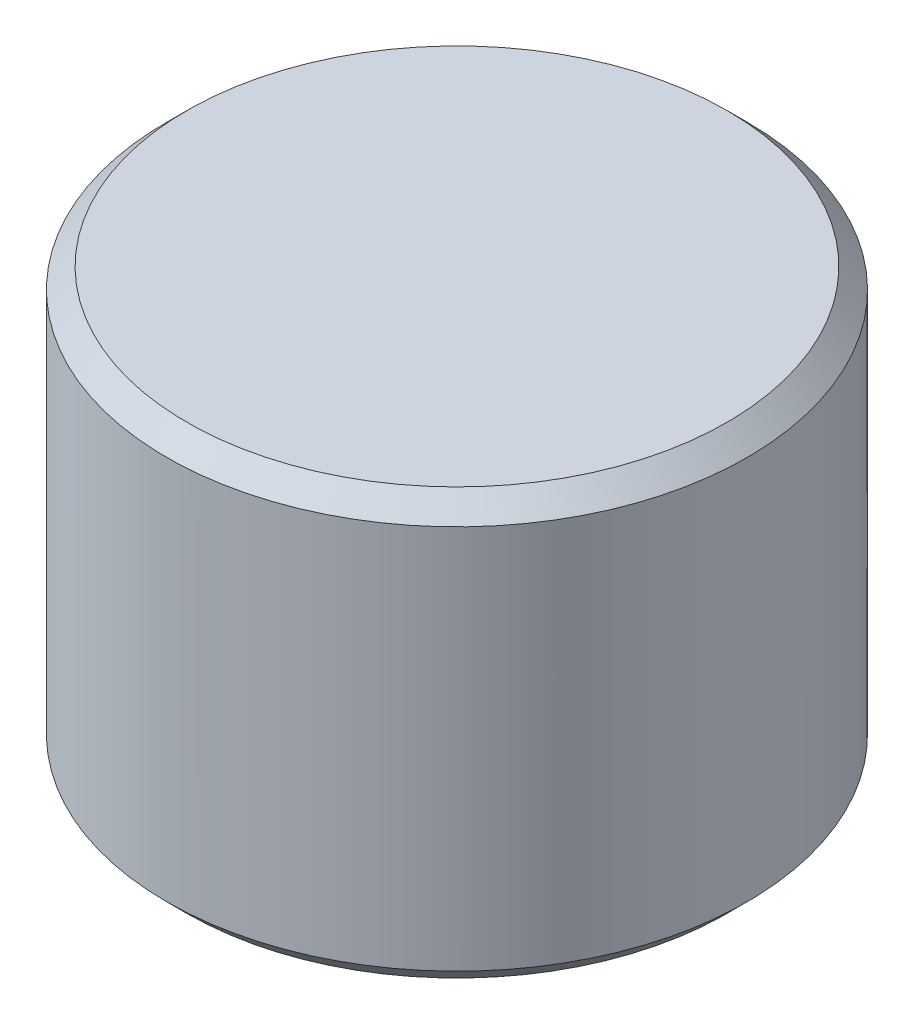
ISO-10303-21;
HEADER;
FILE_DESCRIPTION(('STEP AP214'),'2;1');
FILE_NAME('part.step','',(''),(''),'','','');
FILE_SCHEMA(('AUTOMOTIVE_DESIGN { 1 0 10303 214 1 1 1 1 }'));
ENDSEC;
DATA;
#1=APPLICATION_CONTEXT('core data for automotive mechanical design processes');
#2=APPLICATION_PROTOCOL_DEFINITION('international standard','automotive_design',2000,#1);
#3=PRODUCT_CONTEXT('',#1,'mechanical');
#4=PRODUCT('Part','Part','',(#3));
#5=PRODUCT_RELATED_PRODUCT_CATEGORY('part','',(#4));
#6=PRODUCT_DEFINITION_FORMATION('','',#4);
#7=PRODUCT_DEFINITION_CONTEXT('part definition',#1,'design');
#8=PRODUCT_DEFINITION('design','',#6,#7);
#9=PRODUCT_DEFINITION_SHAPE('','',#8);
#10=(LENGTH_UNIT() NAMED_UNIT(*) SI_UNIT(.MILLI.,.METRE.));
#11=(NAMED_UNIT(*) PLANE_ANGLE_UNIT() SI_UNIT($,.RADIAN.));
#12=(NAMED_UNIT(*) SI_UNIT($,.STERADIAN.) SOLID_ANGLE_UNIT());
#13=UNCERTAINTY_MEASURE_WITH_UNIT(LENGTH_MEASURE(1.E-05),#10,'distance_accuracy_value','');
#14=(GEOMETRIC_REPRESENTATION_CONTEXT(3) GLOBAL_UNCERTAINTY_ASSIGNED_CONTEXT((#13)) GLOBAL_UNIT_ASSIGNED_CONTEXT((#10,
#11,#12)) REPRESENTATION_CONTEXT('',''));
#15=CARTESIAN_POINT('',(0.,0.,0.));
#16=DIRECTION('',(0.,0.,1.));
#17=DIRECTION('',(1.,0.,0.));
#18=AXIS2_PLACEMENT_3D('',#15,#16,#17);
#19=CARTESIAN_POINT('',(0.,6.3,0.));
#20=DIRECTION('',(0.,-1.,0.));
#21=DIRECTION('',(0.,0.,-1.));
#22=AXIS2_PLACEMENT_3D('',#19,#20,#21);
#23=CYLINDRICAL_SURFACE('',#22,4.3);
#24=CARTESIAN_POINT('',(0.,0.300000000000003,0.));
#25=DIRECTION('',(0.,1.,0.));
#26=DIRECTION('',(0.,0.,1.));
#27=AXIS2_PLACEMENT_3D('',#24,#25,#26);
#28=CIRCLE('',#27,4.3);
#29=CARTESIAN_POINT('',(0.,0.300000000000003,4.3));
#30=VERTEX_POINT('',#29);
#31=EDGE_CURVE('E51',#30,#30,#28,.T.);
#32=ORIENTED_EDGE('',*,*,#31,.T.);
#33=EDGE_LOOP('',(#32));
#34=FACE_BOUND('',#33,.T.);
#35=CARTESIAN_POINT('',(0.,5.99999999999999,0.));
#36=DIRECTION('',(0.,1.,0.));
#37=DIRECTION('',(0.,0.,1.));
#38=AXIS2_PLACEMENT_3D('',#35,#36,#37);
#39=CIRCLE('',#38,4.3);
#40=CARTESIAN_POINT('',(0.,5.99999999999999,-4.3));
#41=VERTEX_POINT('',#40);
#42=EDGE_CURVE('E54',#41,#41,#39,.F.);
#43=ORIENTED_EDGE('',*,*,#42,.T.);
#44=EDGE_LOOP('',(#43));
#45=FACE_BOUND('',#44,.T.);
#46=ADVANCED_FACE('F39',(#34,#45),#23,.T.);
#47=CARTESIAN_POINT('',(0.,6.3,0.));
#48=DIRECTION('',(0.,1.,0.));
#49=DIRECTION('',(0.,0.,1.));
#50=AXIS2_PLACEMENT_3D('',#47,#48,#49);
#51=PLANE('',#50);
#52=CARTESIAN_POINT('',(0.,6.3,0.));
#53=DIRECTION('',(0.,1.,0.));
#54=DIRECTION('',(0.,0.,1.));
#55=AXIS2_PLACEMENT_3D('',#52,#53,#54);
#56=CIRCLE('',#55,3.99999999999999);
#57=CARTESIAN_POINT('',(0.,6.3,-4.));
#58=VERTEX_POINT('',#57);
#59=EDGE_CURVE('E10',#58,#58,#56,.T.);
#60=ORIENTED_EDGE('',*,*,#59,.T.);
#61=EDGE_LOOP('',(#60));
#62=FACE_BOUND('',#61,.T.);
#63=ADVANCED_FACE('F72',(#62),#51,.T.);
#64=CARTESIAN_POINT('',(0.,0.,0.));
#65=DIRECTION('',(0.,1.,0.));
#66=DIRECTION('',(0.,0.,1.));
#67=AXIS2_PLACEMENT_3D('',#64,#65,#66);
#68=PLANE('',#67);
#69=CARTESIAN_POINT('',(0.,0.,0.));
#70=DIRECTION('',(0.,1.,0.));
#71=DIRECTION('',(0.,0.,1.));
#72=AXIS2_PLACEMENT_3D('',#69,#70,#71);
#73=CIRCLE('',#72,4.);
#74=CARTESIAN_POINT('',(0.,0.,4.));
#75=VERTEX_POINT('',#74);
#76=EDGE_CURVE('E50',#75,#75,#73,.F.);
#77=ORIENTED_EDGE('',*,*,#76,.T.);
#78=EDGE_LOOP('',(#77));
#79=FACE_BOUND('',#78,.T.);
#80=ADVANCED_FACE('F69',(#79),#68,.F.);
#81=CARTESIAN_POINT('',(0.,0.300000000000003,0.));
#82=DIRECTION('',(0.,1.,0.));
#83=DIRECTION('',(0.,0.,1.));
#84=AXIS2_PLACEMENT_3D('',#81,#82,#83);
#85=CONICAL_SURFACE('',#84,4.3,0.785398163397451);
#86=ORIENTED_EDGE('',*,*,#76,.F.);
#87=EDGE_LOOP('',(#86));
#88=FACE_BOUND('',#87,.T.);
#89=ORIENTED_EDGE('',*,*,#31,.F.);
#90=EDGE_LOOP('',(#89));
#91=FACE_BOUND('',#90,.T.);
#92=ADVANCED_FACE('F61',(#88,#91),#85,.T.);
#93=CARTESIAN_POINT('',(0.,6.3,0.));
#94=DIRECTION('',(0.,-1.,0.));
#95=DIRECTION('',(0.,0.,-1.));
#96=AXIS2_PLACEMENT_3D('',#93,#94,#95);
#97=CONICAL_SURFACE('',#96,3.99999999999999,0.785398163397448);
#98=CARTESIAN_POINT('',(0.,5.99999999999999,-4.3));
#99=CARTESIAN_POINT('',(0.,6.00312499999999,-4.296875));
#100=CARTESIAN_POINT('',(0.,6.00624999999999,-4.29375));
#101=CARTESIAN_POINT('',(0.,6.01249999999999,-4.2875));
#102=CARTESIAN_POINT('',(0.,6.01562499999999,-4.284375));
#103=CARTESIAN_POINT('',(0.,6.021875,-4.278125));
#104=CARTESIAN_POINT('',(0.,6.025,-4.275));
#105=CARTESIAN_POINT('',(0.,6.03124999999999,-4.26875));
#106=CARTESIAN_POINT('',(0.,6.034375,-4.265625));
#107=CARTESIAN_POINT('',(0.,6.040625,-4.259375));
#108=CARTESIAN_POINT('',(0.,6.04375,-4.25625));
#109=CARTESIAN_POINT('',(0.,6.05,-4.25));
#110=CARTESIAN_POINT('',(0.,6.053125,-4.246875));
#111=CARTESIAN_POINT('',(0.,6.059375,-4.240625));
#112=CARTESIAN_POINT('',(0.,6.0625,-4.2375));
#113=CARTESIAN_POINT('',(0.,6.06875,-4.23125));
#114=CARTESIAN_POINT('',(0.,6.071875,-4.228125));
#115=CARTESIAN_POINT('',(0.,6.078125,-4.221875));
#116=CARTESIAN_POINT('',(0.,6.08125,-4.21875));
#117=CARTESIAN_POINT('',(0.,6.0875,-4.2125));
#118=CARTESIAN_POINT('',(0.,6.090625,-4.209375));
#119=CARTESIAN_POINT('',(0.,6.096875,-4.203125));
#120=CARTESIAN_POINT('',(0.,6.1,-4.2));
#121=CARTESIAN_POINT('',(0.,6.10625,-4.19375));
#122=CARTESIAN_POINT('',(0.,6.109375,-4.190625));
#123=CARTESIAN_POINT('',(0.,6.115625,-4.184375));
#124=CARTESIAN_POINT('',(0.,6.11875,-4.18125));
#125=CARTESIAN_POINT('',(0.,6.125,-4.175));
#126=CARTESIAN_POINT('',(0.,6.128125,-4.171875));
#127=CARTESIAN_POINT('',(0.,6.134375,-4.165625));
#128=CARTESIAN_POINT('',(0.,6.1375,-4.1625));
#129=CARTESIAN_POINT('',(0.,6.14375,-4.15625));
#130=CARTESIAN_POINT('',(0.,6.146875,-4.153125));
#131=CARTESIAN_POINT('',(0.,6.153125,-4.146875));
#132=CARTESIAN_POINT('',(0.,6.15625,-4.14375));
#133=CARTESIAN_POINT('',(0.,6.1625,-4.1375));
#134=CARTESIAN_POINT('',(0.,6.165625,-4.134375));
#135=CARTESIAN_POINT('',(0.,6.171875,-4.128125));
#136=CARTESIAN_POINT('',(0.,6.175,-4.125));
#137=CARTESIAN_POINT('',(0.,6.18125,-4.11875));
#138=CARTESIAN_POINT('',(0.,6.184375,-4.115625));
#139=CARTESIAN_POINT('',(0.,6.190625,-4.109375));
#140=CARTESIAN_POINT('',(0.,6.19375,-4.10625));
#141=CARTESIAN_POINT('',(0.,6.2,-4.1));
#142=CARTESIAN_POINT('',(0.,6.203125,-4.096875));
#143=CARTESIAN_POINT('',(0.,6.209375,-4.090625));
#144=CARTESIAN_POINT('',(0.,6.2125,-4.0875));
#145=CARTESIAN_POINT('',(0.,6.21875,-4.08125));
#146=CARTESIAN_POINT('',(0.,6.221875,-4.078125));
#147=CARTESIAN_POINT('',(0.,6.228125,-4.071875));
#148=CARTESIAN_POINT('',(0.,6.23125,-4.06875));
#149=CARTESIAN_POINT('',(0.,6.2375,-4.0625));
#150=CARTESIAN_POINT('',(0.,6.240625,-4.059375));
#151=CARTESIAN_POINT('',(0.,6.246875,-4.053125));
#152=CARTESIAN_POINT('',(0.,6.25,-4.05));
#153=CARTESIAN_POINT('',(0.,6.25625,-4.04375));
#154=CARTESIAN_POINT('',(0.,6.259375,-4.040625));
#155=CARTESIAN_POINT('',(0.,6.265625,-4.034375));
#156=CARTESIAN_POINT('',(0.,6.26875,-4.03125));
#157=CARTESIAN_POINT('',(0.,6.275,-4.025));
#158=CARTESIAN_POINT('',(0.,6.278125,-4.021875));
#159=CARTESIAN_POINT('',(0.,6.284375,-4.015625));
#160=CARTESIAN_POINT('',(0.,6.2875,-4.01249999999999));
#161=CARTESIAN_POINT('',(0.,6.29375,-4.00625));
#162=CARTESIAN_POINT('',(0.,6.296875,-4.003125));
#163=CARTESIAN_POINT('',(0.,6.3,-3.99999999999999));
#164=B_SPLINE_CURVE_WITH_KNOTS('',3,(#98,#99,#100,#101,#102,#103,#104,#105,#106,#107,#108,#109,
#110,#111,#112,#113,#114,#115,#116,#117,#118,#119,#120,#121,#122,#123,#124,#125,#126,#127,#128,
#129,#130,#131,#132,#133,#134,#135,#136,#137,#138,#139,#140,#141,#142,#143,#144,#145,#146,#147,
#148,#149,#150,#151,#152,#153,#154,#155,#156,#157,#158,#159,#160,#161,#162,#163),.UNSPECIFIED.,
.F.,.F.,(4,2,2,2,2,2,2,2,2,2,2,2,2,2,2,2,2,2,2,2,2,2,2,2,2,2,2,2,2,2,2,2,4),(0.,
0.0132582521472488,0.0265165042944963,0.0397747564417451,0.0530330085889926,0.0662912607362401,
0.0795495128834889,0.0928077650307364,0.106066017177984,0.119324269325233,0.13258252147248,
0.145840773619729,0.159099025766977,0.172357277914224,0.185615530061473,0.19887378220872,
0.212132034355968,0.225390286503217,0.238648538650464,0.251906790797713,0.265165042944961,
0.278423295092208,0.291681547239457,0.304939799386704,0.318198051533952,0.331456303681201,
0.344714555828448,0.357972807975697,0.371231060122944,0.384489312270192,0.397747564417441,
0.411005816564688,0.424264068711937),.UNSPECIFIED.);
#165=EDGE_CURVE('BSEAM45',#41,#58,#164,.T.);
#166=ORIENTED_EDGE('',*,*,#42,.F.);
#167=ORIENTED_EDGE('',*,*,#59,.F.);
#168=ORIENTED_EDGE('',*,*,#165,.T.);
#169=ORIENTED_EDGE('',*,*,#165,.F.);
#170=EDGE_LOOP('',(#166,#168,#167,#169));
#171=FACE_BOUND('',#170,.T.);
#172=ADVANCED_FACE('F45',(#171),#97,.T.);
#173=CLOSED_SHELL('',(#46,#63,#80,#92,#172));
#174=MANIFOLD_SOLID_BREP('B2',#173);
#175=ADVANCED_BREP_SHAPE_REPRESENTATION('',(#18,#174),#14);
#176=SHAPE_DEFINITION_REPRESENTATION(#9,#175);
ENDSEC;
END-ISO-10303-21;
